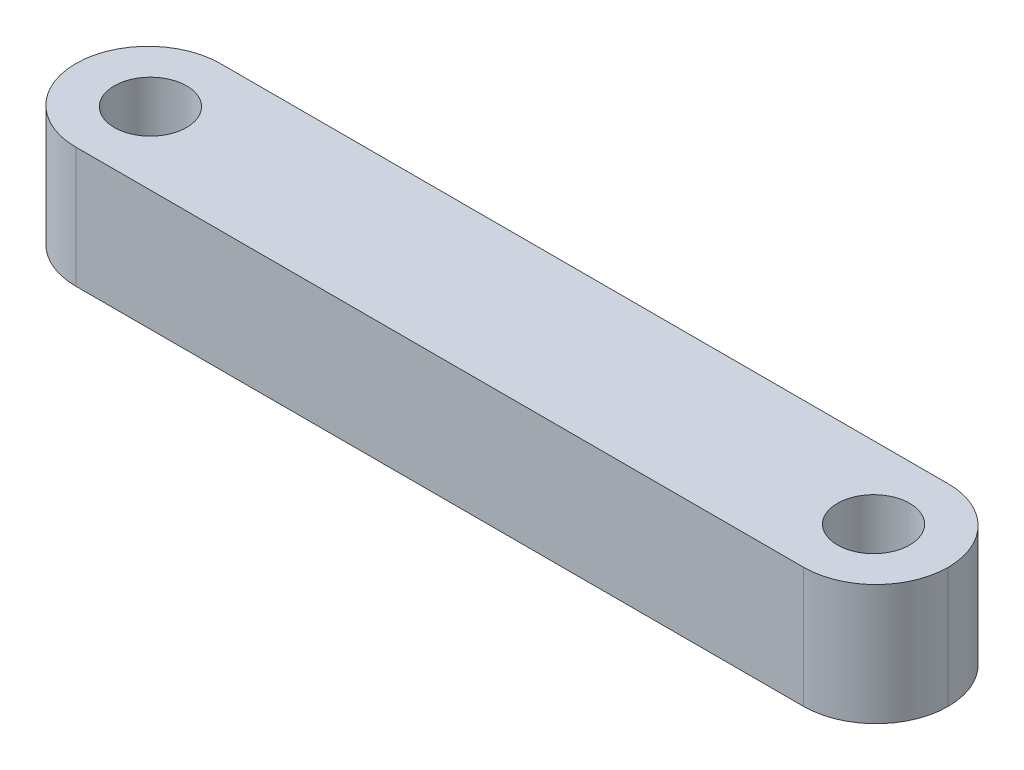
ISO-10303-21;
HEADER;
FILE_DESCRIPTION(('STEP AP214'),'2;1');
FILE_NAME('part.step','',(''),(''),'','','');
FILE_SCHEMA(('AUTOMOTIVE_DESIGN { 1 0 10303 214 1 1 1 1 }'));
ENDSEC;
DATA;
#1=APPLICATION_CONTEXT('core data for automotive mechanical design processes');
#2=APPLICATION_PROTOCOL_DEFINITION('international standard','automotive_design',2000,#1);
#3=PRODUCT_CONTEXT('',#1,'mechanical');
#4=PRODUCT('Part','Part','',(#3));
#5=PRODUCT_RELATED_PRODUCT_CATEGORY('part','',(#4));
#6=PRODUCT_DEFINITION_FORMATION('','',#4);
#7=PRODUCT_DEFINITION_CONTEXT('part definition',#1,'design');
#8=PRODUCT_DEFINITION('design','',#6,#7);
#9=PRODUCT_DEFINITION_SHAPE('','',#8);
#10=(LENGTH_UNIT() NAMED_UNIT(*) SI_UNIT(.MILLI.,.METRE.));
#11=(NAMED_UNIT(*) PLANE_ANGLE_UNIT() SI_UNIT($,.RADIAN.));
#12=(NAMED_UNIT(*) SI_UNIT($,.STERADIAN.) SOLID_ANGLE_UNIT());
#13=UNCERTAINTY_MEASURE_WITH_UNIT(LENGTH_MEASURE(1.E-05),#10,'distance_accuracy_value','');
#14=(GEOMETRIC_REPRESENTATION_CONTEXT(3) GLOBAL_UNCERTAINTY_ASSIGNED_CONTEXT((#13)) GLOBAL_UNIT_ASSIGNED_CONTEXT((#10,
#11,#12)) REPRESENTATION_CONTEXT('',''));
#15=CARTESIAN_POINT('',(0.,0.,0.));
#16=DIRECTION('',(0.,0.,1.));
#17=DIRECTION('',(1.,0.,0.));
#18=AXIS2_PLACEMENT_3D('',#15,#16,#17);
#19=CARTESIAN_POINT('',(0.,10.,0.));
#20=DIRECTION('',(0.,-1.,0.));
#21=DIRECTION('',(0.,0.,-1.));
#22=AXIS2_PLACEMENT_3D('',#19,#20,#21);
#23=PLANE('',#22);
#24=CARTESIAN_POINT('',(30.195,10.,0.));
#25=DIRECTION('',(0.,-1.,0.));
#26=DIRECTION('',(0.,0.,-1.));
#27=AXIS2_PLACEMENT_3D('',#24,#25,#26);
#28=CIRCLE('',#27,6.);
#29=CARTESIAN_POINT('',(30.195,10.,6.));
#30=VERTEX_POINT('',#29);
#31=CARTESIAN_POINT('',(36.195,10.,0.));
#32=VERTEX_POINT('',#31);
#33=EDGE_CURVE('E93',#30,#32,#28,.F.);
#34=ORIENTED_EDGE('',*,*,#33,.T.);
#35=CARTESIAN_POINT('',(30.195,10.,0.));
#36=DIRECTION('',(0.,-1.,0.));
#37=DIRECTION('',(0.,0.,-1.));
#38=AXIS2_PLACEMENT_3D('',#35,#36,#37);
#39=CIRCLE('',#38,6.);
#40=CARTESIAN_POINT('',(30.195,10.,-6.));
#41=VERTEX_POINT('',#40);
#42=EDGE_CURVE('E185',#32,#41,#39,.F.);
#43=ORIENTED_EDGE('',*,*,#42,.T.);
#44=DIRECTION('',(1.,0.,0.));
#45=VECTOR('',#44,1.);
#46=CARTESIAN_POINT('',(-36.195,10.,-6.));
#47=LINE('',#46,#45);
#48=CARTESIAN_POINT('',(-30.195,10.,-6.));
#49=VERTEX_POINT('',#48);
#50=EDGE_CURVE('E167',#49,#41,#47,.T.);
#51=ORIENTED_EDGE('',*,*,#50,.F.);
#52=CARTESIAN_POINT('',(-30.195,10.,0.));
#53=DIRECTION('',(0.,-1.,0.));
#54=DIRECTION('',(0.,0.,-1.));
#55=AXIS2_PLACEMENT_3D('',#52,#53,#54);
#56=CIRCLE('',#55,6.);
#57=CARTESIAN_POINT('',(-36.195,10.,0.));
#58=VERTEX_POINT('',#57);
#59=EDGE_CURVE('E160',#49,#58,#56,.F.);
#60=ORIENTED_EDGE('',*,*,#59,.T.);
#61=CARTESIAN_POINT('',(-30.195,10.,0.));
#62=DIRECTION('',(0.,-1.,0.));
#63=DIRECTION('',(0.,0.,-1.));
#64=AXIS2_PLACEMENT_3D('',#61,#62,#63);
#65=CIRCLE('',#64,6.);
#66=CARTESIAN_POINT('',(-30.195,10.,6.));
#67=VERTEX_POINT('',#66);
#68=EDGE_CURVE('E178',#58,#67,#65,.F.);
#69=ORIENTED_EDGE('',*,*,#68,.T.);
#70=DIRECTION('',(1.,0.,0.));
#71=VECTOR('',#70,1.);
#72=CARTESIAN_POINT('',(-36.195,10.,6.));
#73=LINE('',#72,#71);
#74=EDGE_CURVE('E162',#67,#30,#73,.T.);
#75=ORIENTED_EDGE('',*,*,#74,.T.);
#76=EDGE_LOOP('',(#34,#43,#51,#60,#69,#75));
#77=FACE_BOUND('',#76,.T.);
#78=CARTESIAN_POINT('',(-30.,10.,0.));
#79=DIRECTION('',(0.,1.,0.));
#80=DIRECTION('',(0.,0.,1.));
#81=AXIS2_PLACEMENT_3D('',#78,#79,#80);
#82=CIRCLE('',#81,3.);
#83=CARTESIAN_POINT('',(-30.,10.,3.));
#84=VERTEX_POINT('',#83);
#85=EDGE_CURVE('E157',#84,#84,#82,.T.);
#86=ORIENTED_EDGE('',*,*,#85,.F.);
#87=EDGE_LOOP('',(#86));
#88=FACE_BOUND('',#87,.T.);
#89=CARTESIAN_POINT('',(30.,10.,0.));
#90=DIRECTION('',(0.,1.,0.));
#91=DIRECTION('',(0.,0.,1.));
#92=AXIS2_PLACEMENT_3D('',#89,#90,#91);
#93=CIRCLE('',#92,3.);
#94=CARTESIAN_POINT('',(30.,10.,3.));
#95=VERTEX_POINT('',#94);
#96=EDGE_CURVE('E198',#95,#95,#93,.T.);
#97=ORIENTED_EDGE('',*,*,#96,.F.);
#98=EDGE_LOOP('',(#97));
#99=FACE_BOUND('',#98,.T.);
#100=ADVANCED_FACE('F75',(#77,#88,#99),#23,.F.);
#101=CARTESIAN_POINT('',(0.,0.,0.));
#102=DIRECTION('',(0.,-1.,0.));
#103=DIRECTION('',(0.,0.,-1.));
#104=AXIS2_PLACEMENT_3D('',#101,#102,#103);
#105=PLANE('',#104);
#106=CARTESIAN_POINT('',(-30.,0.,0.));
#107=DIRECTION('',(0.,1.,0.));
#108=DIRECTION('',(0.,0.,1.));
#109=AXIS2_PLACEMENT_3D('',#106,#107,#108);
#110=CIRCLE('',#109,3.);
#111=CARTESIAN_POINT('',(-30.,0.,3.));
#112=VERTEX_POINT('',#111);
#113=EDGE_CURVE('E210',#112,#112,#110,.T.);
#114=ORIENTED_EDGE('',*,*,#113,.T.);
#115=EDGE_LOOP('',(#114));
#116=FACE_BOUND('',#115,.T.);
#117=DIRECTION('',(1.,0.,0.));
#118=VECTOR('',#117,1.);
#119=CARTESIAN_POINT('',(-36.195,0.,-6.));
#120=LINE('',#119,#118);
#121=CARTESIAN_POINT('',(-30.195,0.,-6.));
#122=VERTEX_POINT('',#121);
#123=CARTESIAN_POINT('',(30.195,0.,-6.));
#124=VERTEX_POINT('',#123);
#125=EDGE_CURVE('E135',#122,#124,#120,.T.);
#126=ORIENTED_EDGE('',*,*,#125,.T.);
#127=CARTESIAN_POINT('',(30.195,0.,0.));
#128=DIRECTION('',(0.,-1.,0.));
#129=DIRECTION('',(0.,0.,-1.));
#130=AXIS2_PLACEMENT_3D('',#127,#128,#129);
#131=CIRCLE('',#130,6.);
#132=CARTESIAN_POINT('',(36.195,0.,0.));
#133=VERTEX_POINT('',#132);
#134=EDGE_CURVE('E175',#124,#133,#131,.T.);
#135=ORIENTED_EDGE('',*,*,#134,.T.);
#136=CARTESIAN_POINT('',(30.195,0.,0.));
#137=DIRECTION('',(0.,-1.,0.));
#138=DIRECTION('',(0.,0.,-1.));
#139=AXIS2_PLACEMENT_3D('',#136,#137,#138);
#140=CIRCLE('',#139,6.);
#141=CARTESIAN_POINT('',(30.195,0.,6.));
#142=VERTEX_POINT('',#141);
#143=EDGE_CURVE('E144',#133,#142,#140,.T.);
#144=ORIENTED_EDGE('',*,*,#143,.T.);
#145=DIRECTION('',(1.,0.,0.));
#146=VECTOR('',#145,1.);
#147=CARTESIAN_POINT('',(-36.195,0.,6.));
#148=LINE('',#147,#146);
#149=CARTESIAN_POINT('',(-30.195,0.,6.));
#150=VERTEX_POINT('',#149);
#151=EDGE_CURVE('E156',#150,#142,#148,.T.);
#152=ORIENTED_EDGE('',*,*,#151,.F.);
#153=CARTESIAN_POINT('',(-30.195,0.,0.));
#154=DIRECTION('',(0.,-1.,0.));
#155=DIRECTION('',(0.,0.,-1.));
#156=AXIS2_PLACEMENT_3D('',#153,#154,#155);
#157=CIRCLE('',#156,6.);
#158=CARTESIAN_POINT('',(-36.195,0.,0.));
#159=VERTEX_POINT('',#158);
#160=EDGE_CURVE('E138',#150,#159,#157,.T.);
#161=ORIENTED_EDGE('',*,*,#160,.T.);
#162=CARTESIAN_POINT('',(-30.195,0.,0.));
#163=DIRECTION('',(0.,-1.,0.));
#164=DIRECTION('',(0.,0.,-1.));
#165=AXIS2_PLACEMENT_3D('',#162,#163,#164);
#166=CIRCLE('',#165,6.);
#167=EDGE_CURVE('E131',#159,#122,#166,.T.);
#168=ORIENTED_EDGE('',*,*,#167,.T.);
#169=EDGE_LOOP('',(#126,#135,#144,#152,#161,#168));
#170=FACE_BOUND('',#169,.T.);
#171=CARTESIAN_POINT('',(30.,0.,0.));
#172=DIRECTION('',(0.,1.,0.));
#173=DIRECTION('',(0.,0.,1.));
#174=AXIS2_PLACEMENT_3D('',#171,#172,#173);
#175=CIRCLE('',#174,3.);
#176=CARTESIAN_POINT('',(30.,0.,3.));
#177=VERTEX_POINT('',#176);
#178=EDGE_CURVE('E192',#177,#177,#175,.T.);
#179=ORIENTED_EDGE('',*,*,#178,.T.);
#180=EDGE_LOOP('',(#179));
#181=FACE_BOUND('',#180,.T.);
#182=ADVANCED_FACE('F133',(#116,#170,#181),#105,.T.);
#183=CARTESIAN_POINT('',(-36.195,10.,6.));
#184=DIRECTION('',(0.,0.,-1.));
#185=DIRECTION('',(-1.,0.,0.));
#186=AXIS2_PLACEMENT_3D('',#183,#184,#185);
#187=PLANE('',#186);
#188=ORIENTED_EDGE('',*,*,#151,.T.);
#189=DIRECTION('',(0.,-1.,0.));
#190=VECTOR('',#189,1.);
#191=CARTESIAN_POINT('',(30.195,10.,6.));
#192=LINE('',#191,#190);
#193=EDGE_CURVE('E12',#142,#30,#192,.F.);
#194=ORIENTED_EDGE('',*,*,#193,.T.);
#195=ORIENTED_EDGE('',*,*,#74,.F.);
#196=DIRECTION('',(0.,-1.,0.));
#197=VECTOR('',#196,1.);
#198=CARTESIAN_POINT('',(-30.195,0.,6.));
#199=LINE('',#198,#197);
#200=EDGE_CURVE('E85',#67,#150,#199,.T.);
#201=ORIENTED_EDGE('',*,*,#200,.T.);
#202=EDGE_LOOP('',(#188,#194,#195,#201));
#203=FACE_BOUND('',#202,.T.);
#204=ADVANCED_FACE('F204',(#203),#187,.F.);
#205=CARTESIAN_POINT('',(-36.195,10.,-6.));
#206=DIRECTION('',(0.,0.,-1.));
#207=DIRECTION('',(-1.,0.,0.));
#208=AXIS2_PLACEMENT_3D('',#205,#206,#207);
#209=PLANE('',#208);
#210=ORIENTED_EDGE('',*,*,#50,.T.);
#211=DIRECTION('',(0.,-1.,0.));
#212=VECTOR('',#211,1.);
#213=CARTESIAN_POINT('',(30.195,0.,-6.));
#214=LINE('',#213,#212);
#215=EDGE_CURVE('E154',#41,#124,#214,.T.);
#216=ORIENTED_EDGE('',*,*,#215,.T.);
#217=ORIENTED_EDGE('',*,*,#125,.F.);
#218=DIRECTION('',(0.,-1.,0.));
#219=VECTOR('',#218,1.);
#220=CARTESIAN_POINT('',(-30.195,10.,-6.));
#221=LINE('',#220,#219);
#222=EDGE_CURVE('E151',#122,#49,#221,.F.);
#223=ORIENTED_EDGE('',*,*,#222,.T.);
#224=EDGE_LOOP('',(#210,#216,#217,#223));
#225=FACE_BOUND('',#224,.T.);
#226=ADVANCED_FACE('F150',(#225),#209,.T.);
#227=CARTESIAN_POINT('',(-30.,10.,0.));
#228=DIRECTION('',(0.,-1.,0.));
#229=DIRECTION('',(0.,0.,-1.));
#230=AXIS2_PLACEMENT_3D('',#227,#228,#229);
#231=CYLINDRICAL_SURFACE('',#230,3.);
#232=ORIENTED_EDGE('',*,*,#85,.T.);
#233=EDGE_LOOP('',(#232));
#234=FACE_BOUND('',#233,.T.);
#235=ORIENTED_EDGE('',*,*,#113,.F.);
#236=EDGE_LOOP('',(#235));
#237=FACE_BOUND('',#236,.T.);
#238=ADVANCED_FACE('F233',(#234,#237),#231,.F.);
#239=CARTESIAN_POINT('',(30.,10.,0.));
#240=DIRECTION('',(0.,-1.,0.));
#241=DIRECTION('',(0.,0.,-1.));
#242=AXIS2_PLACEMENT_3D('',#239,#240,#241);
#243=CYLINDRICAL_SURFACE('',#242,3.);
#244=ORIENTED_EDGE('',*,*,#96,.T.);
#245=EDGE_LOOP('',(#244));
#246=FACE_BOUND('',#245,.T.);
#247=ORIENTED_EDGE('',*,*,#178,.F.);
#248=EDGE_LOOP('',(#247));
#249=FACE_BOUND('',#248,.T.);
#250=ADVANCED_FACE('F221',(#246,#249),#243,.F.);
#251=CARTESIAN_POINT('',(30.195,10.,0.));
#252=DIRECTION('',(0.,-1.,0.));
#253=DIRECTION('',(0.,0.,-1.));
#254=AXIS2_PLACEMENT_3D('',#251,#252,#253);
#255=CYLINDRICAL_SURFACE('',#254,6.);
#256=DIRECTION('',(0.,-1.,0.));
#257=VECTOR('',#256,1.);
#258=CARTESIAN_POINT('',(36.195,10.,0.));
#259=LINE('',#258,#257);
#260=EDGE_CURVE('E189',#32,#133,#259,.T.);
#261=ORIENTED_EDGE('',*,*,#260,.F.);
#262=ORIENTED_EDGE('',*,*,#33,.F.);
#263=ORIENTED_EDGE('',*,*,#193,.F.);
#264=ORIENTED_EDGE('',*,*,#143,.F.);
#265=EDGE_LOOP('',(#261,#262,#263,#264));
#266=FACE_BOUND('',#265,.T.);
#267=ADVANCED_FACE('F243',(#266),#255,.T.);
#268=CARTESIAN_POINT('',(30.195,10.,0.));
#269=DIRECTION('',(0.,1.,0.));
#270=DIRECTION('',(0.,0.,1.));
#271=AXIS2_PLACEMENT_3D('',#268,#269,#270);
#272=CYLINDRICAL_SURFACE('',#271,6.);
#273=ORIENTED_EDGE('',*,*,#42,.F.);
#274=ORIENTED_EDGE('',*,*,#260,.T.);
#275=ORIENTED_EDGE('',*,*,#134,.F.);
#276=ORIENTED_EDGE('',*,*,#215,.F.);
#277=EDGE_LOOP('',(#273,#274,#275,#276));
#278=FACE_BOUND('',#277,.T.);
#279=ADVANCED_FACE('F240',(#278),#272,.T.);
#280=CARTESIAN_POINT('',(-30.195,10.,0.));
#281=DIRECTION('',(0.,1.,0.));
#282=DIRECTION('',(0.,0.,1.));
#283=AXIS2_PLACEMENT_3D('',#280,#281,#282);
#284=CYLINDRICAL_SURFACE('',#283,6.);
#285=ORIENTED_EDGE('',*,*,#200,.F.);
#286=ORIENTED_EDGE('',*,*,#68,.F.);
#287=DIRECTION('',(0.,-1.,0.));
#288=VECTOR('',#287,1.);
#289=CARTESIAN_POINT('',(-36.195,10.,0.));
#290=LINE('',#289,#288);
#291=EDGE_CURVE('E79',#159,#58,#290,.F.);
#292=ORIENTED_EDGE('',*,*,#291,.F.);
#293=ORIENTED_EDGE('',*,*,#160,.F.);
#294=EDGE_LOOP('',(#285,#286,#292,#293));
#295=FACE_BOUND('',#294,.T.);
#296=ADVANCED_FACE('F77',(#295),#284,.T.);
#297=CARTESIAN_POINT('',(-30.195,10.,0.));
#298=DIRECTION('',(0.,-1.,0.));
#299=DIRECTION('',(0.,0.,-1.));
#300=AXIS2_PLACEMENT_3D('',#297,#298,#299);
#301=CYLINDRICAL_SURFACE('',#300,6.);
#302=ORIENTED_EDGE('',*,*,#59,.F.);
#303=ORIENTED_EDGE('',*,*,#222,.F.);
#304=ORIENTED_EDGE('',*,*,#167,.F.);
#305=ORIENTED_EDGE('',*,*,#291,.T.);
#306=EDGE_LOOP('',(#302,#303,#304,#305));
#307=FACE_BOUND('',#306,.T.);
#308=ADVANCED_FACE('F159',(#307),#301,.T.);
#309=CLOSED_SHELL('',(#100,#182,#204,#226,#238,#250,#267,#279,#296,#308));
#310=MANIFOLD_SOLID_BREP('B2',#309);
#311=ADVANCED_BREP_SHAPE_REPRESENTATION('',(#18,#310),#14);
#312=SHAPE_DEFINITION_REPRESENTATION(#9,#311);
ENDSEC;
END-ISO-10303-21;
